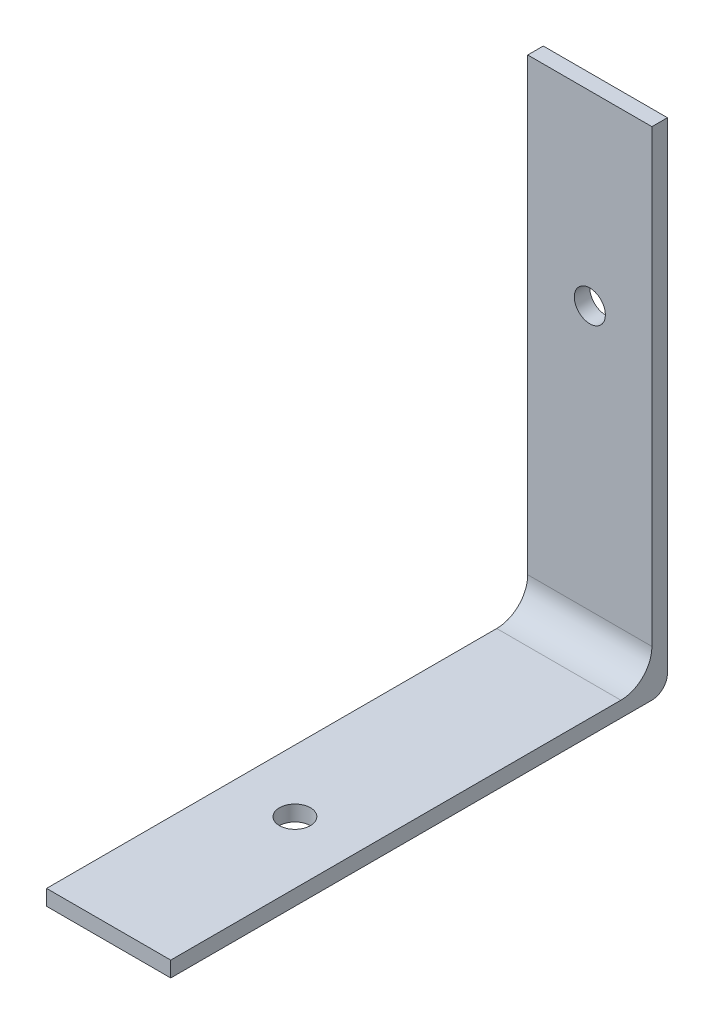
ISO-10303-21;
HEADER;
FILE_DESCRIPTION(('STEP AP214'),'2;1');
FILE_NAME('part.step','',(''),(''),'','','');
FILE_SCHEMA(('AUTOMOTIVE_DESIGN { 1 0 10303 214 1 1 1 1 }'));
ENDSEC;
DATA;
#1=APPLICATION_CONTEXT('core data for automotive mechanical design processes');
#2=APPLICATION_PROTOCOL_DEFINITION('international standard','automotive_design',2000,#1);
#3=PRODUCT_CONTEXT('',#1,'mechanical');
#4=PRODUCT('Part','Part','',(#3));
#5=PRODUCT_RELATED_PRODUCT_CATEGORY('part','',(#4));
#6=PRODUCT_DEFINITION_FORMATION('','',#4);
#7=PRODUCT_DEFINITION_CONTEXT('part definition',#1,'design');
#8=PRODUCT_DEFINITION('design','',#6,#7);
#9=PRODUCT_DEFINITION_SHAPE('','',#8);
#10=(LENGTH_UNIT() NAMED_UNIT(*) SI_UNIT(.MILLI.,.METRE.));
#11=(NAMED_UNIT(*) PLANE_ANGLE_UNIT() SI_UNIT($,.RADIAN.));
#12=(NAMED_UNIT(*) SI_UNIT($,.STERADIAN.) SOLID_ANGLE_UNIT());
#13=UNCERTAINTY_MEASURE_WITH_UNIT(LENGTH_MEASURE(1.E-05),#10,'distance_accuracy_value','');
#14=(GEOMETRIC_REPRESENTATION_CONTEXT(3) GLOBAL_UNCERTAINTY_ASSIGNED_CONTEXT((#13)) GLOBAL_UNIT_ASSIGNED_CONTEXT((#10,
#11,#12)) REPRESENTATION_CONTEXT('',''));
#15=CARTESIAN_POINT('',(0.,0.,0.));
#16=DIRECTION('',(0.,0.,1.));
#17=DIRECTION('',(1.,0.,0.));
#18=AXIS2_PLACEMENT_3D('',#15,#16,#17);
#19=CARTESIAN_POINT('',(12.7,1.5875,0.));
#20=DIRECTION('',(0.,0.,-1.));
#21=DIRECTION('',(0.,1.,0.));
#22=AXIS2_PLACEMENT_3D('',#19,#20,#21);
#23=PLANE('',#22);
#24=DIRECTION('',(0.,-1.,0.));
#25=VECTOR('',#24,1.);
#26=CARTESIAN_POINT('',(0.,1.5875,0.));
#27=LINE('',#26,#25);
#28=CARTESIAN_POINT('',(0.,1.5875,0.));
#29=VERTEX_POINT('',#28);
#30=CARTESIAN_POINT('',(0.,0.,0.));
#31=VERTEX_POINT('',#30);
#32=EDGE_CURVE('E133',#29,#31,#27,.T.);
#33=ORIENTED_EDGE('',*,*,#32,.T.);
#34=DIRECTION('',(-1.,0.,0.));
#35=VECTOR('',#34,1.);
#36=CARTESIAN_POINT('',(12.7,0.,0.));
#37=LINE('',#36,#35);
#38=CARTESIAN_POINT('',(12.7,0.,0.));
#39=VERTEX_POINT('',#38);
#40=EDGE_CURVE('E11',#39,#31,#37,.T.);
#41=ORIENTED_EDGE('',*,*,#40,.F.);
#42=DIRECTION('',(0.,-1.,0.));
#43=VECTOR('',#42,1.);
#44=CARTESIAN_POINT('',(12.7,1.5875,0.));
#45=LINE('',#44,#43);
#46=CARTESIAN_POINT('',(12.7,1.5875,0.));
#47=VERTEX_POINT('',#46);
#48=EDGE_CURVE('E148',#47,#39,#45,.T.);
#49=ORIENTED_EDGE('',*,*,#48,.F.);
#50=DIRECTION('',(-1.,0.,0.));
#51=VECTOR('',#50,1.);
#52=CARTESIAN_POINT('',(12.7,1.5875,0.));
#53=LINE('',#52,#51);
#54=EDGE_CURVE('E129',#47,#29,#53,.T.);
#55=ORIENTED_EDGE('',*,*,#54,.T.);
#56=EDGE_LOOP('',(#33,#41,#49,#55));
#57=FACE_BOUND('',#56,.T.);
#58=ADVANCED_FACE('F37',(#57),#23,.F.);
#59=CARTESIAN_POINT('',(12.7,0.,0.));
#60=DIRECTION('',(0.,1.,0.));
#61=DIRECTION('',(0.,0.,1.));
#62=AXIS2_PLACEMENT_3D('',#59,#60,#61);
#63=PLANE('',#62);
#64=CARTESIAN_POINT('',(6.35,0.,-19.05));
#65=DIRECTION('',(0.,1.,0.));
#66=DIRECTION('',(0.,0.,1.));
#67=AXIS2_PLACEMENT_3D('',#64,#65,#66);
#68=CIRCLE('',#67,1.5875);
#69=CARTESIAN_POINT('',(6.35,0.,-17.4625));
#70=VERTEX_POINT('',#69);
#71=EDGE_CURVE('E186',#70,#70,#68,.T.);
#72=ORIENTED_EDGE('',*,*,#71,.T.);
#73=EDGE_LOOP('',(#72));
#74=FACE_BOUND('',#73,.T.);
#75=DIRECTION('',(0.,0.,-1.));
#76=VECTOR('',#75,1.);
#77=CARTESIAN_POINT('',(0.,0.,0.));
#78=LINE('',#77,#76);
#79=CARTESIAN_POINT('',(0.,0.,-49.2125));
#80=VERTEX_POINT('',#79);
#81=EDGE_CURVE('E136',#31,#80,#78,.T.);
#82=ORIENTED_EDGE('',*,*,#81,.T.);
#83=DIRECTION('',(-1.,0.,0.));
#84=VECTOR('',#83,1.);
#85=CARTESIAN_POINT('',(12.7,0.,-49.2125));
#86=LINE('',#85,#84);
#87=CARTESIAN_POINT('',(12.7,0.,-49.2125));
#88=VERTEX_POINT('',#87);
#89=EDGE_CURVE('E45',#88,#80,#86,.T.);
#90=ORIENTED_EDGE('',*,*,#89,.F.);
#91=DIRECTION('',(0.,0.,-1.));
#92=VECTOR('',#91,1.);
#93=CARTESIAN_POINT('',(12.7,0.,0.));
#94=LINE('',#93,#92);
#95=EDGE_CURVE('E96',#39,#88,#94,.T.);
#96=ORIENTED_EDGE('',*,*,#95,.F.);
#97=ORIENTED_EDGE('',*,*,#40,.T.);
#98=EDGE_LOOP('',(#82,#90,#96,#97));
#99=FACE_BOUND('',#98,.T.);
#100=ADVANCED_FACE('F207',(#74,#99),#63,.F.);
#101=CARTESIAN_POINT('',(12.7,1.58749999999999,-49.2125));
#102=DIRECTION('',(-1.,0.,0.));
#103=DIRECTION('',(0.,0.,1.));
#104=AXIS2_PLACEMENT_3D('',#101,#102,#103);
#105=CYLINDRICAL_SURFACE('',#104,1.58749999999999);
#106=CARTESIAN_POINT('',(0.,1.58749999999999,-49.2125));
#107=DIRECTION('',(1.,0.,0.));
#108=DIRECTION('',(0.,0.,-1.));
#109=AXIS2_PLACEMENT_3D('',#106,#107,#108);
#110=CIRCLE('',#109,1.58749999999999);
#111=CARTESIAN_POINT('',(0.,1.58749999999999,-50.8));
#112=VERTEX_POINT('',#111);
#113=EDGE_CURVE('E139',#80,#112,#110,.T.);
#114=ORIENTED_EDGE('',*,*,#113,.T.);
#115=DIRECTION('',(-1.,0.,0.));
#116=VECTOR('',#115,1.);
#117=CARTESIAN_POINT('',(12.7,1.58749999999999,-50.8));
#118=LINE('',#117,#116);
#119=CARTESIAN_POINT('',(12.7,1.58749999999999,-50.8));
#120=VERTEX_POINT('',#119);
#121=EDGE_CURVE('E155',#120,#112,#118,.T.);
#122=ORIENTED_EDGE('',*,*,#121,.F.);
#123=CARTESIAN_POINT('',(12.7,1.58749999999999,-49.2125));
#124=DIRECTION('',(1.,0.,0.));
#125=DIRECTION('',(0.,0.,-1.));
#126=AXIS2_PLACEMENT_3D('',#123,#124,#125);
#127=CIRCLE('',#126,1.58749999999999);
#128=EDGE_CURVE('E163',#88,#120,#127,.T.);
#129=ORIENTED_EDGE('',*,*,#128,.F.);
#130=ORIENTED_EDGE('',*,*,#89,.T.);
#131=EDGE_LOOP('',(#114,#122,#129,#130));
#132=FACE_BOUND('',#131,.T.);
#133=ADVANCED_FACE('F161',(#132),#105,.T.);
#134=CARTESIAN_POINT('',(12.7,1.58749999999999,-50.8));
#135=DIRECTION('',(0.,0.,1.));
#136=DIRECTION('',(0.,-1.,0.));
#137=AXIS2_PLACEMENT_3D('',#134,#135,#136);
#138=PLANE('',#137);
#139=CARTESIAN_POINT('',(6.35,31.75,-50.8));
#140=DIRECTION('',(0.,0.,1.));
#141=DIRECTION('',(0.,-1.,0.));
#142=AXIS2_PLACEMENT_3D('',#139,#140,#141);
#143=CIRCLE('',#142,1.5875);
#144=CARTESIAN_POINT('',(6.35,30.1625,-50.8));
#145=VERTEX_POINT('',#144);
#146=EDGE_CURVE('E137',#145,#145,#143,.T.);
#147=ORIENTED_EDGE('',*,*,#146,.T.);
#148=EDGE_LOOP('',(#147));
#149=FACE_BOUND('',#148,.T.);
#150=DIRECTION('',(0.,1.,0.));
#151=VECTOR('',#150,1.);
#152=CARTESIAN_POINT('',(0.,1.58749999999999,-50.8));
#153=LINE('',#152,#151);
#154=CARTESIAN_POINT('',(0.,50.8,-50.8));
#155=VERTEX_POINT('',#154);
#156=EDGE_CURVE('E141',#112,#155,#153,.T.);
#157=ORIENTED_EDGE('',*,*,#156,.T.);
#158=DIRECTION('',(-1.,0.,0.));
#159=VECTOR('',#158,1.);
#160=CARTESIAN_POINT('',(12.7,50.8,-50.8));
#161=LINE('',#160,#159);
#162=CARTESIAN_POINT('',(12.7,50.8,-50.8));
#163=VERTEX_POINT('',#162);
#164=EDGE_CURVE('E152',#163,#155,#161,.T.);
#165=ORIENTED_EDGE('',*,*,#164,.F.);
#166=DIRECTION('',(0.,1.,0.));
#167=VECTOR('',#166,1.);
#168=CARTESIAN_POINT('',(12.7,1.58749999999999,-50.8));
#169=LINE('',#168,#167);
#170=EDGE_CURVE('E175',#120,#163,#169,.T.);
#171=ORIENTED_EDGE('',*,*,#170,.F.);
#172=ORIENTED_EDGE('',*,*,#121,.T.);
#173=EDGE_LOOP('',(#157,#165,#171,#172));
#174=FACE_BOUND('',#173,.T.);
#175=ADVANCED_FACE('F171',(#149,#174),#138,.F.);
#176=CARTESIAN_POINT('',(12.7,50.8,-50.8));
#177=DIRECTION('',(0.,-1.,0.));
#178=DIRECTION('',(0.,0.,-1.));
#179=AXIS2_PLACEMENT_3D('',#176,#177,#178);
#180=PLANE('',#179);
#181=DIRECTION('',(0.,0.,1.));
#182=VECTOR('',#181,1.);
#183=CARTESIAN_POINT('',(0.,50.8,-50.8));
#184=LINE('',#183,#182);
#185=CARTESIAN_POINT('',(0.,50.8,-49.2125));
#186=VERTEX_POINT('',#185);
#187=EDGE_CURVE('E143',#155,#186,#184,.T.);
#188=ORIENTED_EDGE('',*,*,#187,.T.);
#189=DIRECTION('',(-1.,0.,0.));
#190=VECTOR('',#189,1.);
#191=CARTESIAN_POINT('',(12.7,50.8,-49.2125));
#192=LINE('',#191,#190);
#193=CARTESIAN_POINT('',(12.7,50.8,-49.2125));
#194=VERTEX_POINT('',#193);
#195=EDGE_CURVE('E124',#194,#186,#192,.T.);
#196=ORIENTED_EDGE('',*,*,#195,.F.);
#197=DIRECTION('',(0.,0.,1.));
#198=VECTOR('',#197,1.);
#199=CARTESIAN_POINT('',(12.7,50.8,-50.8));
#200=LINE('',#199,#198);
#201=EDGE_CURVE('E115',#163,#194,#200,.T.);
#202=ORIENTED_EDGE('',*,*,#201,.F.);
#203=ORIENTED_EDGE('',*,*,#164,.T.);
#204=EDGE_LOOP('',(#188,#196,#202,#203));
#205=FACE_BOUND('',#204,.T.);
#206=ADVANCED_FACE('F174',(#205),#180,.F.);
#207=CARTESIAN_POINT('',(12.7,50.8,-49.2125));
#208=DIRECTION('',(0.,0.,-1.));
#209=DIRECTION('',(-1.,0.,0.));
#210=AXIS2_PLACEMENT_3D('',#207,#208,#209);
#211=PLANE('',#210);
#212=CARTESIAN_POINT('',(6.35,31.75,-49.2125));
#213=DIRECTION('',(0.,0.,1.));
#214=DIRECTION('',(1.,0.,0.));
#215=AXIS2_PLACEMENT_3D('',#212,#213,#214);
#216=CIRCLE('',#215,1.5875);
#217=CARTESIAN_POINT('',(7.9375,31.75,-49.2125));
#218=VERTEX_POINT('',#217);
#219=EDGE_CURVE('E183',#218,#218,#216,.T.);
#220=ORIENTED_EDGE('',*,*,#219,.F.);
#221=EDGE_LOOP('',(#220));
#222=FACE_BOUND('',#221,.T.);
#223=DIRECTION('',(0.,-1.,0.));
#224=VECTOR('',#223,1.);
#225=CARTESIAN_POINT('',(0.,50.8,-49.2125));
#226=LINE('',#225,#224);
#227=CARTESIAN_POINT('',(0.,4.7625,-49.2125));
#228=VERTEX_POINT('',#227);
#229=EDGE_CURVE('E123',#186,#228,#226,.T.);
#230=ORIENTED_EDGE('',*,*,#229,.T.);
#231=DIRECTION('',(-1.,0.,0.));
#232=VECTOR('',#231,1.);
#233=CARTESIAN_POINT('',(12.7,4.7625,-49.2125));
#234=LINE('',#233,#232);
#235=CARTESIAN_POINT('',(12.7,4.7625,-49.2125));
#236=VERTEX_POINT('',#235);
#237=EDGE_CURVE('E120',#236,#228,#234,.T.);
#238=ORIENTED_EDGE('',*,*,#237,.F.);
#239=DIRECTION('',(0.,-1.,0.));
#240=VECTOR('',#239,1.);
#241=CARTESIAN_POINT('',(12.7,50.8,-49.2125));
#242=LINE('',#241,#240);
#243=EDGE_CURVE('E109',#194,#236,#242,.T.);
#244=ORIENTED_EDGE('',*,*,#243,.F.);
#245=ORIENTED_EDGE('',*,*,#195,.T.);
#246=EDGE_LOOP('',(#230,#238,#244,#245));
#247=FACE_BOUND('',#246,.T.);
#248=ADVANCED_FACE('F121',(#222,#247),#211,.F.);
#249=CARTESIAN_POINT('',(12.7,4.7625,-46.0375));
#250=DIRECTION('',(-1.,0.,0.));
#251=DIRECTION('',(0.,0.,1.));
#252=AXIS2_PLACEMENT_3D('',#249,#250,#251);
#253=CYLINDRICAL_SURFACE('',#252,3.17499999999999);
#254=CARTESIAN_POINT('',(0.,4.7625,-46.0375));
#255=DIRECTION('',(-1.,0.,0.));
#256=DIRECTION('',(0.,0.,1.));
#257=AXIS2_PLACEMENT_3D('',#254,#255,#256);
#258=CIRCLE('',#257,3.17499999999999);
#259=CARTESIAN_POINT('',(0.,1.5875,-46.0375));
#260=VERTEX_POINT('',#259);
#261=EDGE_CURVE('E82',#228,#260,#258,.T.);
#262=ORIENTED_EDGE('',*,*,#261,.T.);
#263=DIRECTION('',(-1.,0.,0.));
#264=VECTOR('',#263,1.);
#265=CARTESIAN_POINT('',(12.7,1.5875,-46.0375));
#266=LINE('',#265,#264);
#267=CARTESIAN_POINT('',(12.7,1.5875,-46.0375));
#268=VERTEX_POINT('',#267);
#269=EDGE_CURVE('E125',#268,#260,#266,.T.);
#270=ORIENTED_EDGE('',*,*,#269,.F.);
#271=CARTESIAN_POINT('',(12.7,4.7625,-46.0375));
#272=DIRECTION('',(-1.,0.,0.));
#273=DIRECTION('',(0.,0.,1.));
#274=AXIS2_PLACEMENT_3D('',#271,#272,#273);
#275=CIRCLE('',#274,3.17499999999999);
#276=EDGE_CURVE('E113',#236,#268,#275,.T.);
#277=ORIENTED_EDGE('',*,*,#276,.F.);
#278=ORIENTED_EDGE('',*,*,#237,.T.);
#279=EDGE_LOOP('',(#262,#270,#277,#278));
#280=FACE_BOUND('',#279,.T.);
#281=ADVANCED_FACE('F127',(#280),#253,.F.);
#282=CARTESIAN_POINT('',(12.7,1.5875,-46.0375));
#283=DIRECTION('',(0.,-1.,0.));
#284=DIRECTION('',(0.,0.,-1.));
#285=AXIS2_PLACEMENT_3D('',#282,#283,#284);
#286=PLANE('',#285);
#287=CARTESIAN_POINT('',(6.35,1.5875,-19.05));
#288=DIRECTION('',(0.,1.,0.));
#289=DIRECTION('',(0.,0.,1.));
#290=AXIS2_PLACEMENT_3D('',#287,#288,#289);
#291=CIRCLE('',#290,1.5875);
#292=CARTESIAN_POINT('',(6.35,1.5875,-17.4625));
#293=VERTEX_POINT('',#292);
#294=EDGE_CURVE('E189',#293,#293,#291,.T.);
#295=ORIENTED_EDGE('',*,*,#294,.F.);
#296=EDGE_LOOP('',(#295));
#297=FACE_BOUND('',#296,.T.);
#298=DIRECTION('',(0.,0.,1.));
#299=VECTOR('',#298,1.);
#300=CARTESIAN_POINT('',(0.,1.5875,-46.0375));
#301=LINE('',#300,#299);
#302=EDGE_CURVE('E88',#260,#29,#301,.T.);
#303=ORIENTED_EDGE('',*,*,#302,.T.);
#304=ORIENTED_EDGE('',*,*,#54,.F.);
#305=DIRECTION('',(0.,0.,1.));
#306=VECTOR('',#305,1.);
#307=CARTESIAN_POINT('',(12.7,1.5875,-46.0375));
#308=LINE('',#307,#306);
#309=EDGE_CURVE('E53',#268,#47,#308,.T.);
#310=ORIENTED_EDGE('',*,*,#309,.F.);
#311=ORIENTED_EDGE('',*,*,#269,.T.);
#312=EDGE_LOOP('',(#303,#304,#310,#311));
#313=FACE_BOUND('',#312,.T.);
#314=ADVANCED_FACE('F196',(#297,#313),#286,.F.);
#315=CARTESIAN_POINT('',(12.7,1.58749999999999,-49.2125));
#316=DIRECTION('',(1.,0.,0.));
#317=DIRECTION('',(0.,0.,-1.));
#318=AXIS2_PLACEMENT_3D('',#315,#316,#317);
#319=PLANE('',#318);
#320=ORIENTED_EDGE('',*,*,#48,.T.);
#321=ORIENTED_EDGE('',*,*,#95,.T.);
#322=ORIENTED_EDGE('',*,*,#128,.T.);
#323=ORIENTED_EDGE('',*,*,#170,.T.);
#324=ORIENTED_EDGE('',*,*,#201,.T.);
#325=ORIENTED_EDGE('',*,*,#243,.T.);
#326=ORIENTED_EDGE('',*,*,#276,.T.);
#327=ORIENTED_EDGE('',*,*,#309,.T.);
#328=EDGE_LOOP('',(#320,#321,#322,#323,#324,#325,#326,#327));
#329=FACE_BOUND('',#328,.T.);
#330=ADVANCED_FACE('F111',(#329),#319,.T.);
#331=CARTESIAN_POINT('',(0.,1.58749999999999,-49.2125));
#332=DIRECTION('',(1.,0.,0.));
#333=DIRECTION('',(0.,0.,-1.));
#334=AXIS2_PLACEMENT_3D('',#331,#332,#333);
#335=PLANE('',#334);
#336=ORIENTED_EDGE('',*,*,#32,.F.);
#337=ORIENTED_EDGE('',*,*,#302,.F.);
#338=ORIENTED_EDGE('',*,*,#261,.F.);
#339=ORIENTED_EDGE('',*,*,#229,.F.);
#340=ORIENTED_EDGE('',*,*,#187,.F.);
#341=ORIENTED_EDGE('',*,*,#156,.F.);
#342=ORIENTED_EDGE('',*,*,#113,.F.);
#343=ORIENTED_EDGE('',*,*,#81,.F.);
#344=EDGE_LOOP('',(#336,#337,#338,#339,#340,#341,#342,#343));
#345=FACE_BOUND('',#344,.T.);
#346=ADVANCED_FACE('F167',(#345),#335,.F.);
#347=CARTESIAN_POINT('',(6.35,31.75,-66.7385));
#348=DIRECTION('',(0.,0.,1.));
#349=DIRECTION('',(1.,0.,0.));
#350=AXIS2_PLACEMENT_3D('',#347,#348,#349);
#351=CYLINDRICAL_SURFACE('',#350,1.5875);
#352=ORIENTED_EDGE('',*,*,#219,.T.);
#353=EDGE_LOOP('',(#352));
#354=FACE_BOUND('',#353,.T.);
#355=ORIENTED_EDGE('',*,*,#146,.F.);
#356=EDGE_LOOP('',(#355));
#357=FACE_BOUND('',#356,.T.);
#358=ADVANCED_FACE('F231',(#354,#357),#351,.F.);
#359=CARTESIAN_POINT('',(6.35,-15.9385,-19.05));
#360=DIRECTION('',(0.,1.,0.));
#361=DIRECTION('',(0.,0.,1.));
#362=AXIS2_PLACEMENT_3D('',#359,#360,#361);
#363=CYLINDRICAL_SURFACE('',#362,1.5875);
#364=ORIENTED_EDGE('',*,*,#294,.T.);
#365=EDGE_LOOP('',(#364));
#366=FACE_BOUND('',#365,.T.);
#367=ORIENTED_EDGE('',*,*,#71,.F.);
#368=EDGE_LOOP('',(#367));
#369=FACE_BOUND('',#368,.T.);
#370=ADVANCED_FACE('F193',(#366,#369),#363,.F.);
#371=CLOSED_SHELL('',(#58,#100,#133,#175,#206,#248,#281,#314,#330,#346,#358,#370));
#372=MANIFOLD_SOLID_BREP('B2',#371);
#373=ADVANCED_BREP_SHAPE_REPRESENTATION('',(#18,#372),#14);
#374=SHAPE_DEFINITION_REPRESENTATION(#9,#373);
ENDSEC;
END-ISO-10303-21;
